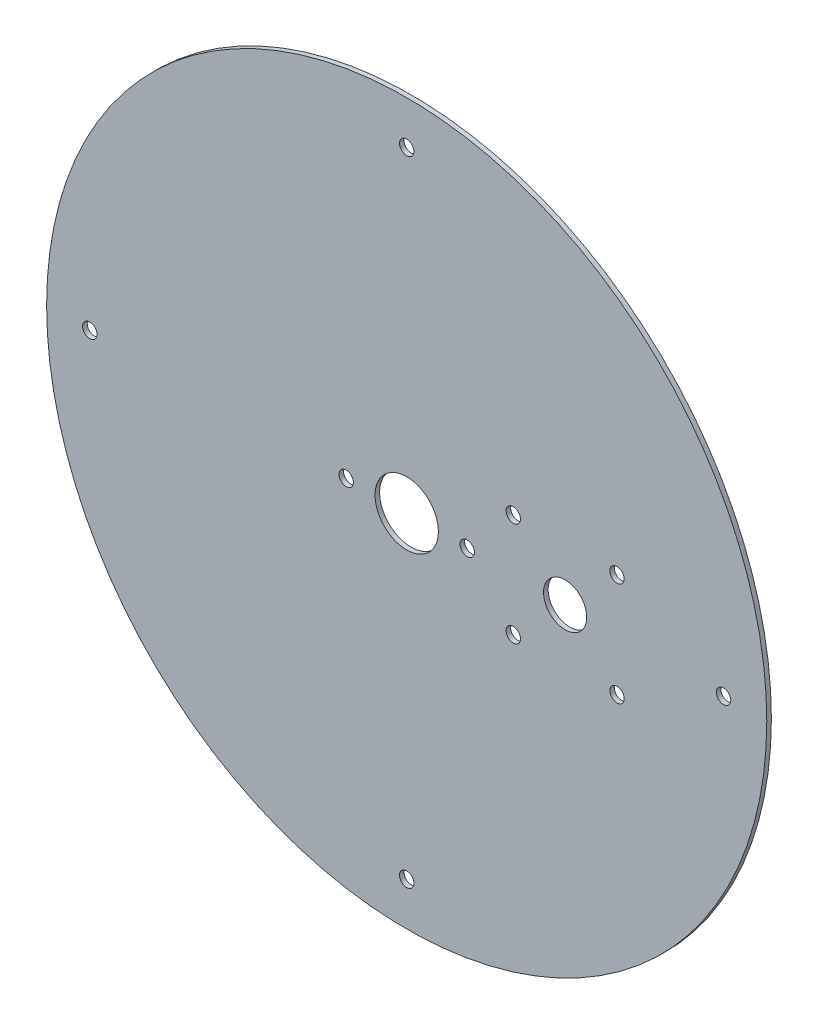
ISO-10303-21;
HEADER;
FILE_DESCRIPTION(('STEP AP214'),'2;1');
FILE_NAME('part.step','',(''),(''),'','','');
FILE_SCHEMA(('AUTOMOTIVE_DESIGN { 1 0 10303 214 1 1 1 1 }'));
ENDSEC;
DATA;
#1=APPLICATION_CONTEXT('core data for automotive mechanical design processes');
#2=APPLICATION_PROTOCOL_DEFINITION('international standard','automotive_design',2000,#1);
#3=PRODUCT_CONTEXT('',#1,'mechanical');
#4=PRODUCT('Part','Part','',(#3));
#5=PRODUCT_RELATED_PRODUCT_CATEGORY('part','',(#4));
#6=PRODUCT_DEFINITION_FORMATION('','',#4);
#7=PRODUCT_DEFINITION_CONTEXT('part definition',#1,'design');
#8=PRODUCT_DEFINITION('design','',#6,#7);
#9=PRODUCT_DEFINITION_SHAPE('','',#8);
#10=(LENGTH_UNIT() NAMED_UNIT(*) SI_UNIT(.MILLI.,.METRE.));
#11=(NAMED_UNIT(*) PLANE_ANGLE_UNIT() SI_UNIT($,.RADIAN.));
#12=(NAMED_UNIT(*) SI_UNIT($,.STERADIAN.) SOLID_ANGLE_UNIT());
#13=UNCERTAINTY_MEASURE_WITH_UNIT(LENGTH_MEASURE(1.E-05),#10,'distance_accuracy_value','');
#14=(GEOMETRIC_REPRESENTATION_CONTEXT(3) GLOBAL_UNCERTAINTY_ASSIGNED_CONTEXT((#13)) GLOBAL_UNIT_ASSIGNED_CONTEXT((#10,
#11,#12)) REPRESENTATION_CONTEXT('',''));
#15=CARTESIAN_POINT('',(0.,0.,0.));
#16=DIRECTION('',(0.,0.,1.));
#17=DIRECTION('',(1.,0.,0.));
#18=AXIS2_PLACEMENT_3D('',#15,#16,#17);
#19=CARTESIAN_POINT('',(0.,0.,1.6));
#20=DIRECTION('',(0.,0.,-1.));
#21=DIRECTION('',(-1.,0.,0.));
#22=AXIS2_PLACEMENT_3D('',#19,#20,#21);
#23=CYLINDRICAL_SURFACE('',#22,125.);
#24=CARTESIAN_POINT('',(0.,0.,1.6));
#25=DIRECTION('',(0.,0.,1.));
#26=DIRECTION('',(1.,0.,0.));
#27=AXIS2_PLACEMENT_3D('',#24,#25,#26);
#28=CIRCLE('',#27,125.);
#29=CARTESIAN_POINT('',(125.,0.,1.6));
#30=VERTEX_POINT('',#29);
#31=EDGE_CURVE('E12',#30,#30,#28,.T.);
#32=ORIENTED_EDGE('',*,*,#31,.F.);
#33=EDGE_LOOP('',(#32));
#34=FACE_BOUND('',#33,.T.);
#35=CARTESIAN_POINT('',(0.,0.,0.));
#36=DIRECTION('',(0.,0.,1.));
#37=DIRECTION('',(1.,0.,0.));
#38=AXIS2_PLACEMENT_3D('',#35,#36,#37);
#39=CIRCLE('',#38,125.);
#40=CARTESIAN_POINT('',(125.,0.,0.));
#41=VERTEX_POINT('',#40);
#42=EDGE_CURVE('E49',#41,#41,#39,.T.);
#43=ORIENTED_EDGE('',*,*,#42,.T.);
#44=EDGE_LOOP('',(#43));
#45=FACE_BOUND('',#44,.T.);
#46=ADVANCED_FACE('F46',(#34,#45),#23,.T.);
#47=CARTESIAN_POINT('',(0.,0.,1.6));
#48=DIRECTION('',(0.,0.,1.));
#49=DIRECTION('',(1.,0.,0.));
#50=AXIS2_PLACEMENT_3D('',#47,#48,#49);
#51=PLANE('',#50);
#52=CARTESIAN_POINT('',(0.,110.,1.6));
#53=DIRECTION('',(0.,0.,1.));
#54=DIRECTION('',(1.,0.,0.));
#55=AXIS2_PLACEMENT_3D('',#52,#53,#54);
#56=CIRCLE('',#55,2.49999999999999);
#57=CARTESIAN_POINT('',(2.49999999999998,110.,1.6));
#58=VERTEX_POINT('',#57);
#59=EDGE_CURVE('E126',#58,#58,#56,.T.);
#60=ORIENTED_EDGE('',*,*,#59,.F.);
#61=EDGE_LOOP('',(#60));
#62=FACE_BOUND('',#61,.T.);
#63=CARTESIAN_POINT('',(0.,-110.,1.6));
#64=DIRECTION('',(0.,0.,1.));
#65=DIRECTION('',(1.,0.,0.));
#66=AXIS2_PLACEMENT_3D('',#63,#64,#65);
#67=CIRCLE('',#66,2.49999999999999);
#68=CARTESIAN_POINT('',(2.5,-110.,1.6));
#69=VERTEX_POINT('',#68);
#70=EDGE_CURVE('E120',#69,#69,#67,.T.);
#71=ORIENTED_EDGE('',*,*,#70,.F.);
#72=EDGE_LOOP('',(#71));
#73=FACE_BOUND('',#72,.T.);
#74=CARTESIAN_POINT('',(37.,18.,1.6));
#75=DIRECTION('',(0.,0.,1.));
#76=DIRECTION('',(1.,0.,0.));
#77=AXIS2_PLACEMENT_3D('',#74,#75,#76);
#78=CIRCLE('',#77,2.49999999999999);
#79=CARTESIAN_POINT('',(39.5,18.,1.6));
#80=VERTEX_POINT('',#79);
#81=EDGE_CURVE('E114',#80,#80,#78,.T.);
#82=ORIENTED_EDGE('',*,*,#81,.F.);
#83=EDGE_LOOP('',(#82));
#84=FACE_BOUND('',#83,.T.);
#85=CARTESIAN_POINT('',(73.,18.,1.6));
#86=DIRECTION('',(0.,0.,1.));
#87=DIRECTION('',(1.,0.,0.));
#88=AXIS2_PLACEMENT_3D('',#85,#86,#87);
#89=CIRCLE('',#88,2.49999999999999);
#90=CARTESIAN_POINT('',(75.5,18.,1.6));
#91=VERTEX_POINT('',#90);
#92=EDGE_CURVE('E108',#91,#91,#89,.T.);
#93=ORIENTED_EDGE('',*,*,#92,.F.);
#94=EDGE_LOOP('',(#93));
#95=FACE_BOUND('',#94,.T.);
#96=CARTESIAN_POINT('',(73.,-18.,1.6));
#97=DIRECTION('',(0.,0.,1.));
#98=DIRECTION('',(1.,0.,0.));
#99=AXIS2_PLACEMENT_3D('',#96,#97,#98);
#100=CIRCLE('',#99,2.49999999999999);
#101=CARTESIAN_POINT('',(75.5,-18.,1.6));
#102=VERTEX_POINT('',#101);
#103=EDGE_CURVE('E102',#102,#102,#100,.T.);
#104=ORIENTED_EDGE('',*,*,#103,.F.);
#105=EDGE_LOOP('',(#104));
#106=FACE_BOUND('',#105,.T.);
#107=CARTESIAN_POINT('',(37.,-18.,1.6));
#108=DIRECTION('',(0.,0.,1.));
#109=DIRECTION('',(1.,0.,0.));
#110=AXIS2_PLACEMENT_3D('',#107,#108,#109);
#111=CIRCLE('',#110,2.49999999999999);
#112=CARTESIAN_POINT('',(39.5,-18.,1.6));
#113=VERTEX_POINT('',#112);
#114=EDGE_CURVE('E96',#113,#113,#111,.T.);
#115=ORIENTED_EDGE('',*,*,#114,.F.);
#116=EDGE_LOOP('',(#115));
#117=FACE_BOUND('',#116,.T.);
#118=CARTESIAN_POINT('',(21.,0.,1.6));
#119=DIRECTION('',(0.,0.,1.));
#120=DIRECTION('',(1.,0.,0.));
#121=AXIS2_PLACEMENT_3D('',#118,#119,#120);
#122=CIRCLE('',#121,2.49999999999999);
#123=CARTESIAN_POINT('',(23.5,0.,1.6));
#124=VERTEX_POINT('',#123);
#125=EDGE_CURVE('E90',#124,#124,#122,.T.);
#126=ORIENTED_EDGE('',*,*,#125,.F.);
#127=EDGE_LOOP('',(#126));
#128=FACE_BOUND('',#127,.T.);
#129=CARTESIAN_POINT('',(-21.,0.,1.6));
#130=DIRECTION('',(0.,0.,1.));
#131=DIRECTION('',(1.,0.,0.));
#132=AXIS2_PLACEMENT_3D('',#129,#130,#131);
#133=CIRCLE('',#132,2.49999999999999);
#134=CARTESIAN_POINT('',(-18.5,0.,1.6));
#135=VERTEX_POINT('',#134);
#136=EDGE_CURVE('E84',#135,#135,#133,.T.);
#137=ORIENTED_EDGE('',*,*,#136,.F.);
#138=EDGE_LOOP('',(#137));
#139=FACE_BOUND('',#138,.T.);
#140=CARTESIAN_POINT('',(-110.,7.63278329429795E-13,1.6));
#141=DIRECTION('',(0.,0.,1.));
#142=DIRECTION('',(1.,0.,0.));
#143=AXIS2_PLACEMENT_3D('',#140,#141,#142);
#144=CIRCLE('',#143,2.49999999999999);
#145=CARTESIAN_POINT('',(-107.5,7.63278329429795E-13,1.6));
#146=VERTEX_POINT('',#145);
#147=EDGE_CURVE('E78',#146,#146,#144,.T.);
#148=ORIENTED_EDGE('',*,*,#147,.F.);
#149=EDGE_LOOP('',(#148));
#150=FACE_BOUND('',#149,.T.);
#151=CARTESIAN_POINT('',(110.,0.,1.6));
#152=DIRECTION('',(0.,0.,1.));
#153=DIRECTION('',(1.,0.,0.));
#154=AXIS2_PLACEMENT_3D('',#151,#152,#153);
#155=CIRCLE('',#154,2.5);
#156=CARTESIAN_POINT('',(112.5,0.,1.6));
#157=VERTEX_POINT('',#156);
#158=EDGE_CURVE('E72',#157,#157,#155,.T.);
#159=ORIENTED_EDGE('',*,*,#158,.F.);
#160=EDGE_LOOP('',(#159));
#161=FACE_BOUND('',#160,.T.);
#162=CARTESIAN_POINT('',(55.,0.,1.6));
#163=DIRECTION('',(0.,0.,1.));
#164=DIRECTION('',(1.,0.,0.));
#165=AXIS2_PLACEMENT_3D('',#162,#163,#164);
#166=CIRCLE('',#165,7.5);
#167=CARTESIAN_POINT('',(62.5,0.,1.6));
#168=VERTEX_POINT('',#167);
#169=EDGE_CURVE('E64',#168,#168,#166,.T.);
#170=ORIENTED_EDGE('',*,*,#169,.F.);
#171=EDGE_LOOP('',(#170));
#172=FACE_BOUND('',#171,.T.);
#173=CARTESIAN_POINT('',(0.,0.,1.6));
#174=DIRECTION('',(0.,0.,1.));
#175=DIRECTION('',(1.,0.,0.));
#176=AXIS2_PLACEMENT_3D('',#173,#174,#175);
#177=CIRCLE('',#176,11.);
#178=CARTESIAN_POINT('',(11.,0.,1.6));
#179=VERTEX_POINT('',#178);
#180=EDGE_CURVE('E58',#179,#179,#177,.T.);
#181=ORIENTED_EDGE('',*,*,#180,.F.);
#182=EDGE_LOOP('',(#181));
#183=FACE_BOUND('',#182,.T.);
#184=ORIENTED_EDGE('',*,*,#31,.T.);
#185=EDGE_LOOP('',(#184));
#186=FACE_BOUND('',#185,.T.);
#187=ADVANCED_FACE('F132',(#62,#73,#84,#95,#106,#117,#128,#139,#150,#161,#172,#183,#186),#51,.T.);
#188=CARTESIAN_POINT('',(0.,0.,0.));
#189=DIRECTION('',(0.,0.,1.));
#190=DIRECTION('',(1.,0.,0.));
#191=AXIS2_PLACEMENT_3D('',#188,#189,#190);
#192=PLANE('',#191);
#193=CARTESIAN_POINT('',(0.,110.,0.));
#194=DIRECTION('',(0.,0.,1.));
#195=DIRECTION('',(1.,0.,0.));
#196=AXIS2_PLACEMENT_3D('',#193,#194,#195);
#197=CIRCLE('',#196,2.49999999999999);
#198=CARTESIAN_POINT('',(2.49999999999998,110.,0.));
#199=VERTEX_POINT('',#198);
#200=EDGE_CURVE('E123',#199,#199,#197,.T.);
#201=ORIENTED_EDGE('',*,*,#200,.T.);
#202=EDGE_LOOP('',(#201));
#203=FACE_BOUND('',#202,.T.);
#204=CARTESIAN_POINT('',(0.,-110.,0.));
#205=DIRECTION('',(0.,0.,1.));
#206=DIRECTION('',(1.,0.,0.));
#207=AXIS2_PLACEMENT_3D('',#204,#205,#206);
#208=CIRCLE('',#207,2.49999999999999);
#209=CARTESIAN_POINT('',(2.5,-110.,0.));
#210=VERTEX_POINT('',#209);
#211=EDGE_CURVE('E117',#210,#210,#208,.T.);
#212=ORIENTED_EDGE('',*,*,#211,.T.);
#213=EDGE_LOOP('',(#212));
#214=FACE_BOUND('',#213,.T.);
#215=CARTESIAN_POINT('',(37.,18.,0.));
#216=DIRECTION('',(0.,0.,1.));
#217=DIRECTION('',(1.,0.,0.));
#218=AXIS2_PLACEMENT_3D('',#215,#216,#217);
#219=CIRCLE('',#218,2.49999999999999);
#220=CARTESIAN_POINT('',(39.5,18.,0.));
#221=VERTEX_POINT('',#220);
#222=EDGE_CURVE('E111',#221,#221,#219,.T.);
#223=ORIENTED_EDGE('',*,*,#222,.T.);
#224=EDGE_LOOP('',(#223));
#225=FACE_BOUND('',#224,.T.);
#226=CARTESIAN_POINT('',(73.,18.,0.));
#227=DIRECTION('',(0.,0.,1.));
#228=DIRECTION('',(1.,0.,0.));
#229=AXIS2_PLACEMENT_3D('',#226,#227,#228);
#230=CIRCLE('',#229,2.49999999999999);
#231=CARTESIAN_POINT('',(75.5,18.,0.));
#232=VERTEX_POINT('',#231);
#233=EDGE_CURVE('E105',#232,#232,#230,.T.);
#234=ORIENTED_EDGE('',*,*,#233,.T.);
#235=EDGE_LOOP('',(#234));
#236=FACE_BOUND('',#235,.T.);
#237=CARTESIAN_POINT('',(73.,-18.,0.));
#238=DIRECTION('',(0.,0.,1.));
#239=DIRECTION('',(1.,0.,0.));
#240=AXIS2_PLACEMENT_3D('',#237,#238,#239);
#241=CIRCLE('',#240,2.49999999999999);
#242=CARTESIAN_POINT('',(75.5,-18.,0.));
#243=VERTEX_POINT('',#242);
#244=EDGE_CURVE('E99',#243,#243,#241,.T.);
#245=ORIENTED_EDGE('',*,*,#244,.T.);
#246=EDGE_LOOP('',(#245));
#247=FACE_BOUND('',#246,.T.);
#248=CARTESIAN_POINT('',(37.,-18.,0.));
#249=DIRECTION('',(0.,0.,1.));
#250=DIRECTION('',(1.,0.,0.));
#251=AXIS2_PLACEMENT_3D('',#248,#249,#250);
#252=CIRCLE('',#251,2.49999999999999);
#253=CARTESIAN_POINT('',(39.5,-18.,0.));
#254=VERTEX_POINT('',#253);
#255=EDGE_CURVE('E93',#254,#254,#252,.T.);
#256=ORIENTED_EDGE('',*,*,#255,.T.);
#257=EDGE_LOOP('',(#256));
#258=FACE_BOUND('',#257,.T.);
#259=CARTESIAN_POINT('',(21.,0.,0.));
#260=DIRECTION('',(0.,0.,1.));
#261=DIRECTION('',(1.,0.,0.));
#262=AXIS2_PLACEMENT_3D('',#259,#260,#261);
#263=CIRCLE('',#262,2.49999999999999);
#264=CARTESIAN_POINT('',(23.5,0.,0.));
#265=VERTEX_POINT('',#264);
#266=EDGE_CURVE('E87',#265,#265,#263,.T.);
#267=ORIENTED_EDGE('',*,*,#266,.T.);
#268=EDGE_LOOP('',(#267));
#269=FACE_BOUND('',#268,.T.);
#270=CARTESIAN_POINT('',(-21.,0.,0.));
#271=DIRECTION('',(0.,0.,1.));
#272=DIRECTION('',(1.,0.,0.));
#273=AXIS2_PLACEMENT_3D('',#270,#271,#272);
#274=CIRCLE('',#273,2.49999999999999);
#275=CARTESIAN_POINT('',(-18.5,0.,0.));
#276=VERTEX_POINT('',#275);
#277=EDGE_CURVE('E81',#276,#276,#274,.T.);
#278=ORIENTED_EDGE('',*,*,#277,.T.);
#279=EDGE_LOOP('',(#278));
#280=FACE_BOUND('',#279,.T.);
#281=CARTESIAN_POINT('',(-110.,7.63278329429795E-13,0.));
#282=DIRECTION('',(0.,0.,1.));
#283=DIRECTION('',(1.,0.,0.));
#284=AXIS2_PLACEMENT_3D('',#281,#282,#283);
#285=CIRCLE('',#284,2.49999999999999);
#286=CARTESIAN_POINT('',(-107.5,7.63278329429795E-13,0.));
#287=VERTEX_POINT('',#286);
#288=EDGE_CURVE('E75',#287,#287,#285,.T.);
#289=ORIENTED_EDGE('',*,*,#288,.T.);
#290=EDGE_LOOP('',(#289));
#291=FACE_BOUND('',#290,.T.);
#292=CARTESIAN_POINT('',(110.,0.,0.));
#293=DIRECTION('',(0.,0.,1.));
#294=DIRECTION('',(1.,0.,0.));
#295=AXIS2_PLACEMENT_3D('',#292,#293,#294);
#296=CIRCLE('',#295,2.5);
#297=CARTESIAN_POINT('',(112.5,0.,0.));
#298=VERTEX_POINT('',#297);
#299=EDGE_CURVE('E67',#298,#298,#296,.T.);
#300=ORIENTED_EDGE('',*,*,#299,.T.);
#301=EDGE_LOOP('',(#300));
#302=FACE_BOUND('',#301,.T.);
#303=CARTESIAN_POINT('',(55.,0.,0.));
#304=DIRECTION('',(0.,0.,1.));
#305=DIRECTION('',(1.,0.,0.));
#306=AXIS2_PLACEMENT_3D('',#303,#304,#305);
#307=CIRCLE('',#306,7.5);
#308=CARTESIAN_POINT('',(62.5,0.,0.));
#309=VERTEX_POINT('',#308);
#310=EDGE_CURVE('E61',#309,#309,#307,.T.);
#311=ORIENTED_EDGE('',*,*,#310,.T.);
#312=EDGE_LOOP('',(#311));
#313=FACE_BOUND('',#312,.T.);
#314=CARTESIAN_POINT('',(0.,0.,0.));
#315=DIRECTION('',(0.,0.,1.));
#316=DIRECTION('',(1.,0.,0.));
#317=AXIS2_PLACEMENT_3D('',#314,#315,#316);
#318=CIRCLE('',#317,11.);
#319=CARTESIAN_POINT('',(11.,0.,0.));
#320=VERTEX_POINT('',#319);
#321=EDGE_CURVE('E56',#320,#320,#318,.T.);
#322=ORIENTED_EDGE('',*,*,#321,.T.);
#323=EDGE_LOOP('',(#322));
#324=FACE_BOUND('',#323,.T.);
#325=ORIENTED_EDGE('',*,*,#42,.F.);
#326=EDGE_LOOP('',(#325));
#327=FACE_BOUND('',#326,.T.);
#328=ADVANCED_FACE('F135',(#203,#214,#225,#236,#247,#258,#269,#280,#291,#302,#313,#324,#327),
#192,.F.);
#329=CARTESIAN_POINT('',(0.,0.,0.));
#330=DIRECTION('',(0.,0.,1.));
#331=DIRECTION('',(1.,0.,0.));
#332=AXIS2_PLACEMENT_3D('',#329,#330,#331);
#333=CYLINDRICAL_SURFACE('',#332,11.);
#334=ORIENTED_EDGE('',*,*,#321,.F.);
#335=EDGE_LOOP('',(#334));
#336=FACE_BOUND('',#335,.T.);
#337=ORIENTED_EDGE('',*,*,#180,.T.);
#338=EDGE_LOOP('',(#337));
#339=FACE_BOUND('',#338,.T.);
#340=ADVANCED_FACE('F159',(#336,#339),#333,.F.);
#341=CARTESIAN_POINT('',(55.,0.,0.));
#342=DIRECTION('',(0.,0.,1.));
#343=DIRECTION('',(1.,0.,0.));
#344=AXIS2_PLACEMENT_3D('',#341,#342,#343);
#345=CYLINDRICAL_SURFACE('',#344,7.5);
#346=ORIENTED_EDGE('',*,*,#310,.F.);
#347=EDGE_LOOP('',(#346));
#348=FACE_BOUND('',#347,.T.);
#349=ORIENTED_EDGE('',*,*,#169,.T.);
#350=EDGE_LOOP('',(#349));
#351=FACE_BOUND('',#350,.T.);
#352=ADVANCED_FACE('F161',(#348,#351),#345,.F.);
#353=CARTESIAN_POINT('',(110.,0.,1.6));
#354=DIRECTION('',(0.,0.,1.));
#355=DIRECTION('',(1.,0.,0.));
#356=AXIS2_PLACEMENT_3D('',#353,#354,#355);
#357=CYLINDRICAL_SURFACE('',#356,2.5);
#358=ORIENTED_EDGE('',*,*,#299,.F.);
#359=EDGE_LOOP('',(#358));
#360=FACE_BOUND('',#359,.T.);
#361=ORIENTED_EDGE('',*,*,#158,.T.);
#362=EDGE_LOOP('',(#361));
#363=FACE_BOUND('',#362,.T.);
#364=ADVANCED_FACE('F168',(#360,#363),#357,.F.);
#365=CARTESIAN_POINT('',(-110.,7.63278329429795E-13,1.6));
#366=DIRECTION('',(0.,0.,1.));
#367=DIRECTION('',(1.,0.,0.));
#368=AXIS2_PLACEMENT_3D('',#365,#366,#367);
#369=CYLINDRICAL_SURFACE('',#368,2.49999999999999);
#370=ORIENTED_EDGE('',*,*,#288,.F.);
#371=EDGE_LOOP('',(#370));
#372=FACE_BOUND('',#371,.T.);
#373=ORIENTED_EDGE('',*,*,#147,.T.);
#374=EDGE_LOOP('',(#373));
#375=FACE_BOUND('',#374,.T.);
#376=ADVANCED_FACE('F239',(#372,#375),#369,.F.);
#377=CARTESIAN_POINT('',(-21.,0.,1.6));
#378=DIRECTION('',(0.,0.,1.));
#379=DIRECTION('',(1.,0.,0.));
#380=AXIS2_PLACEMENT_3D('',#377,#378,#379);
#381=CYLINDRICAL_SURFACE('',#380,2.49999999999999);
#382=ORIENTED_EDGE('',*,*,#277,.F.);
#383=EDGE_LOOP('',(#382));
#384=FACE_BOUND('',#383,.T.);
#385=ORIENTED_EDGE('',*,*,#136,.T.);
#386=EDGE_LOOP('',(#385));
#387=FACE_BOUND('',#386,.T.);
#388=ADVANCED_FACE('F235',(#384,#387),#381,.F.);
#389=CARTESIAN_POINT('',(21.,0.,1.6));
#390=DIRECTION('',(0.,0.,1.));
#391=DIRECTION('',(1.,0.,0.));
#392=AXIS2_PLACEMENT_3D('',#389,#390,#391);
#393=CYLINDRICAL_SURFACE('',#392,2.49999999999999);
#394=ORIENTED_EDGE('',*,*,#266,.F.);
#395=EDGE_LOOP('',(#394));
#396=FACE_BOUND('',#395,.T.);
#397=ORIENTED_EDGE('',*,*,#125,.T.);
#398=EDGE_LOOP('',(#397));
#399=FACE_BOUND('',#398,.T.);
#400=ADVANCED_FACE('F231',(#396,#399),#393,.F.);
#401=CARTESIAN_POINT('',(37.,-18.,1.6));
#402=DIRECTION('',(0.,0.,1.));
#403=DIRECTION('',(1.,0.,0.));
#404=AXIS2_PLACEMENT_3D('',#401,#402,#403);
#405=CYLINDRICAL_SURFACE('',#404,2.49999999999999);
#406=ORIENTED_EDGE('',*,*,#255,.F.);
#407=EDGE_LOOP('',(#406));
#408=FACE_BOUND('',#407,.T.);
#409=ORIENTED_EDGE('',*,*,#114,.T.);
#410=EDGE_LOOP('',(#409));
#411=FACE_BOUND('',#410,.T.);
#412=ADVANCED_FACE('F227',(#408,#411),#405,.F.);
#413=CARTESIAN_POINT('',(73.,-18.,1.6));
#414=DIRECTION('',(0.,0.,1.));
#415=DIRECTION('',(1.,0.,0.));
#416=AXIS2_PLACEMENT_3D('',#413,#414,#415);
#417=CYLINDRICAL_SURFACE('',#416,2.49999999999999);
#418=ORIENTED_EDGE('',*,*,#244,.F.);
#419=EDGE_LOOP('',(#418));
#420=FACE_BOUND('',#419,.T.);
#421=ORIENTED_EDGE('',*,*,#103,.T.);
#422=EDGE_LOOP('',(#421));
#423=FACE_BOUND('',#422,.T.);
#424=ADVANCED_FACE('F223',(#420,#423),#417,.F.);
#425=CARTESIAN_POINT('',(73.,18.,1.6));
#426=DIRECTION('',(0.,0.,1.));
#427=DIRECTION('',(1.,0.,0.));
#428=AXIS2_PLACEMENT_3D('',#425,#426,#427);
#429=CYLINDRICAL_SURFACE('',#428,2.49999999999999);
#430=ORIENTED_EDGE('',*,*,#233,.F.);
#431=EDGE_LOOP('',(#430));
#432=FACE_BOUND('',#431,.T.);
#433=ORIENTED_EDGE('',*,*,#92,.T.);
#434=EDGE_LOOP('',(#433));
#435=FACE_BOUND('',#434,.T.);
#436=ADVANCED_FACE('F219',(#432,#435),#429,.F.);
#437=CARTESIAN_POINT('',(37.,18.,1.6));
#438=DIRECTION('',(0.,0.,1.));
#439=DIRECTION('',(1.,0.,0.));
#440=AXIS2_PLACEMENT_3D('',#437,#438,#439);
#441=CYLINDRICAL_SURFACE('',#440,2.49999999999999);
#442=ORIENTED_EDGE('',*,*,#222,.F.);
#443=EDGE_LOOP('',(#442));
#444=FACE_BOUND('',#443,.T.);
#445=ORIENTED_EDGE('',*,*,#81,.T.);
#446=EDGE_LOOP('',(#445));
#447=FACE_BOUND('',#446,.T.);
#448=ADVANCED_FACE('F200',(#444,#447),#441,.F.);
#449=CARTESIAN_POINT('',(0.,-110.,1.6));
#450=DIRECTION('',(0.,0.,1.));
#451=DIRECTION('',(1.,0.,0.));
#452=AXIS2_PLACEMENT_3D('',#449,#450,#451);
#453=CYLINDRICAL_SURFACE('',#452,2.49999999999999);
#454=ORIENTED_EDGE('',*,*,#211,.F.);
#455=EDGE_LOOP('',(#454));
#456=FACE_BOUND('',#455,.T.);
#457=ORIENTED_EDGE('',*,*,#70,.T.);
#458=EDGE_LOOP('',(#457));
#459=FACE_BOUND('',#458,.T.);
#460=ADVANCED_FACE('F195',(#456,#459),#453,.F.);
#461=CARTESIAN_POINT('',(0.,110.,1.6));
#462=DIRECTION('',(0.,0.,1.));
#463=DIRECTION('',(1.,0.,0.));
#464=AXIS2_PLACEMENT_3D('',#461,#462,#463);
#465=CYLINDRICAL_SURFACE('',#464,2.49999999999999);
#466=ORIENTED_EDGE('',*,*,#200,.F.);
#467=EDGE_LOOP('',(#466));
#468=FACE_BOUND('',#467,.T.);
#469=ORIENTED_EDGE('',*,*,#59,.T.);
#470=EDGE_LOOP('',(#469));
#471=FACE_BOUND('',#470,.T.);
#472=ADVANCED_FACE('F130',(#468,#471),#465,.F.);
#473=CLOSED_SHELL('',(#46,#187,#328,#340,#352,#364,#376,#388,#400,#412,#424,#436,#448,#460,#472));
#474=MANIFOLD_SOLID_BREP('B2',#473);
#475=ADVANCED_BREP_SHAPE_REPRESENTATION('',(#18,#474),#14);
#476=SHAPE_DEFINITION_REPRESENTATION(#9,#475);
ENDSEC;
END-ISO-10303-21;
